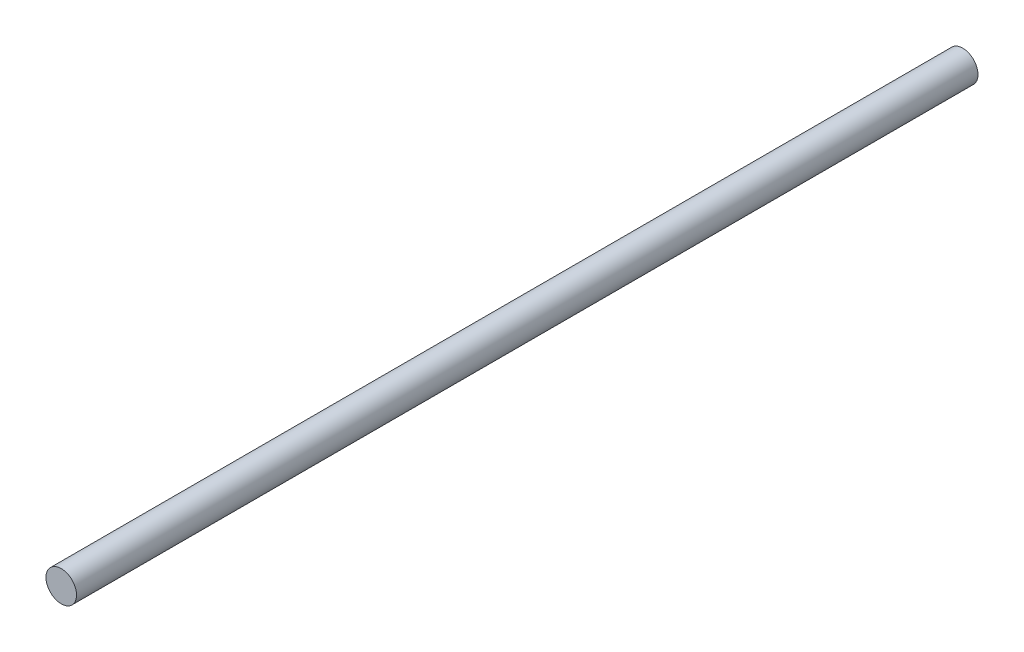
ISO-10303-21;
HEADER;
FILE_DESCRIPTION(('STEP AP214'),'2;1');
FILE_NAME('part.step','',(''),(''),'','','');
FILE_SCHEMA(('AUTOMOTIVE_DESIGN { 1 0 10303 214 1 1 1 1 }'));
ENDSEC;
DATA;
#1=APPLICATION_CONTEXT('core data for automotive mechanical design processes');
#2=APPLICATION_PROTOCOL_DEFINITION('international standard','automotive_design',2000,#1);
#3=PRODUCT_CONTEXT('',#1,'mechanical');
#4=PRODUCT('Part','Part','',(#3));
#5=PRODUCT_RELATED_PRODUCT_CATEGORY('part','',(#4));
#6=PRODUCT_DEFINITION_FORMATION('','',#4);
#7=PRODUCT_DEFINITION_CONTEXT('part definition',#1,'design');
#8=PRODUCT_DEFINITION('design','',#6,#7);
#9=PRODUCT_DEFINITION_SHAPE('','',#8);
#10=(LENGTH_UNIT() NAMED_UNIT(*) SI_UNIT(.MILLI.,.METRE.));
#11=(NAMED_UNIT(*) PLANE_ANGLE_UNIT() SI_UNIT($,.RADIAN.));
#12=(NAMED_UNIT(*) SI_UNIT($,.STERADIAN.) SOLID_ANGLE_UNIT());
#13=UNCERTAINTY_MEASURE_WITH_UNIT(LENGTH_MEASURE(1.E-05),#10,'distance_accuracy_value','');
#14=(GEOMETRIC_REPRESENTATION_CONTEXT(3) GLOBAL_UNCERTAINTY_ASSIGNED_CONTEXT((#13)) GLOBAL_UNIT_ASSIGNED_CONTEXT((#10,
#11,#12)) REPRESENTATION_CONTEXT('',''));
#15=CARTESIAN_POINT('',(0.,0.,0.));
#16=DIRECTION('',(0.,0.,1.));
#17=DIRECTION('',(1.,0.,0.));
#18=AXIS2_PLACEMENT_3D('',#15,#16,#17);
#19=CARTESIAN_POINT('',(0.,0.,354.));
#20=DIRECTION('',(0.,0.,-1.));
#21=DIRECTION('',(-1.,0.,0.));
#22=AXIS2_PLACEMENT_3D('',#19,#20,#21);
#23=CYLINDRICAL_SURFACE('',#22,6.);
#24=CARTESIAN_POINT('',(0.,0.,354.));
#25=DIRECTION('',(0.,0.,1.));
#26=DIRECTION('',(1.,0.,0.));
#27=AXIS2_PLACEMENT_3D('',#24,#25,#26);
#28=CIRCLE('',#27,6.);
#29=CARTESIAN_POINT('',(6.,0.,354.));
#30=VERTEX_POINT('',#29);
#31=EDGE_CURVE('E10',#30,#30,#28,.T.);
#32=ORIENTED_EDGE('',*,*,#31,.F.);
#33=EDGE_LOOP('',(#32));
#34=FACE_BOUND('',#33,.T.);
#35=CARTESIAN_POINT('',(0.,0.,0.));
#36=DIRECTION('',(0.,0.,1.));
#37=DIRECTION('',(1.,0.,0.));
#38=AXIS2_PLACEMENT_3D('',#35,#36,#37);
#39=CIRCLE('',#38,6.);
#40=CARTESIAN_POINT('',(6.,0.,0.));
#41=VERTEX_POINT('',#40);
#42=EDGE_CURVE('E36',#41,#41,#39,.T.);
#43=ORIENTED_EDGE('',*,*,#42,.T.);
#44=EDGE_LOOP('',(#43));
#45=FACE_BOUND('',#44,.T.);
#46=ADVANCED_FACE('F33',(#34,#45),#23,.T.);
#47=CARTESIAN_POINT('',(0.,0.,354.));
#48=DIRECTION('',(0.,0.,1.));
#49=DIRECTION('',(1.,0.,0.));
#50=AXIS2_PLACEMENT_3D('',#47,#48,#49);
#51=PLANE('',#50);
#52=ORIENTED_EDGE('',*,*,#31,.T.);
#53=EDGE_LOOP('',(#52));
#54=FACE_BOUND('',#53,.T.);
#55=ADVANCED_FACE('F48',(#54),#51,.T.);
#56=CARTESIAN_POINT('',(0.,0.,0.));
#57=DIRECTION('',(0.,0.,1.));
#58=DIRECTION('',(1.,0.,0.));
#59=AXIS2_PLACEMENT_3D('',#56,#57,#58);
#60=PLANE('',#59);
#61=ORIENTED_EDGE('',*,*,#42,.F.);
#62=EDGE_LOOP('',(#61));
#63=FACE_BOUND('',#62,.T.);
#64=ADVANCED_FACE('F46',(#63),#60,.F.);
#65=CLOSED_SHELL('',(#46,#55,#64));
#66=MANIFOLD_SOLID_BREP('B2',#65);
#67=ADVANCED_BREP_SHAPE_REPRESENTATION('',(#18,#66),#14);
#68=SHAPE_DEFINITION_REPRESENTATION(#9,#67);
ENDSEC;
END-ISO-10303-21;
